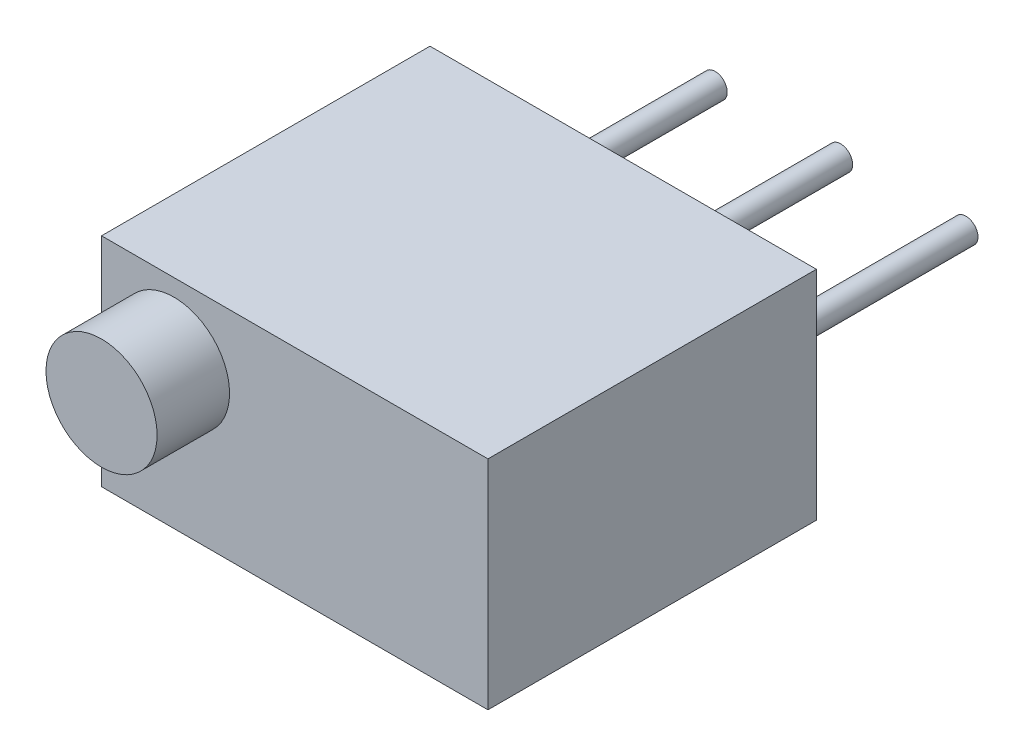
ISO-10303-21;
HEADER;
FILE_DESCRIPTION(('STEP AP214'),'2;1');
FILE_NAME('part.step','',(''),(''),'','','');
FILE_SCHEMA(('AUTOMOTIVE_DESIGN { 1 0 10303 214 1 1 1 1 }'));
ENDSEC;
DATA;
#1=APPLICATION_CONTEXT('core data for automotive mechanical design processes');
#2=APPLICATION_PROTOCOL_DEFINITION('international standard','automotive_design',2000,#1);
#3=PRODUCT_CONTEXT('',#1,'mechanical');
#4=PRODUCT('Part','Part','',(#3));
#5=PRODUCT_RELATED_PRODUCT_CATEGORY('part','',(#4));
#6=PRODUCT_DEFINITION_FORMATION('','',#4);
#7=PRODUCT_DEFINITION_CONTEXT('part definition',#1,'design');
#8=PRODUCT_DEFINITION('design','',#6,#7);
#9=PRODUCT_DEFINITION_SHAPE('','',#8);
#10=(LENGTH_UNIT() NAMED_UNIT(*) SI_UNIT(.MILLI.,.METRE.));
#11=(NAMED_UNIT(*) PLANE_ANGLE_UNIT() SI_UNIT($,.RADIAN.));
#12=(NAMED_UNIT(*) SI_UNIT($,.STERADIAN.) SOLID_ANGLE_UNIT());
#13=UNCERTAINTY_MEASURE_WITH_UNIT(LENGTH_MEASURE(1.E-05),#10,'distance_accuracy_value','');
#14=(GEOMETRIC_REPRESENTATION_CONTEXT(3) GLOBAL_UNCERTAINTY_ASSIGNED_CONTEXT((#13)) GLOBAL_UNIT_ASSIGNED_CONTEXT((#10,
#11,#12)) REPRESENTATION_CONTEXT('',''));
#15=CARTESIAN_POINT('',(0.,0.,0.));
#16=DIRECTION('',(0.,0.,1.));
#17=DIRECTION('',(1.,0.,0.));
#18=AXIS2_PLACEMENT_3D('',#15,#16,#17);
#19=CARTESIAN_POINT('',(-4.,4.5,3.39999999999999));
#20=DIRECTION('',(0.,0.,-1.));
#21=DIRECTION('',(-1.,0.,0.));
#22=AXIS2_PLACEMENT_3D('',#19,#20,#21);
#23=PLANE('',#22);
#24=DIRECTION('',(1.,0.,0.));
#25=VECTOR('',#24,1.);
#26=CARTESIAN_POINT('',(-4.,0.,3.39999999999999));
#27=LINE('',#26,#25);
#28=CARTESIAN_POINT('',(-4.,0.,3.39999999999999));
#29=VERTEX_POINT('',#28);
#30=CARTESIAN_POINT('',(4.00000000000002,0.,3.39999999999999));
#31=VERTEX_POINT('',#30);
#32=EDGE_CURVE('E91',#29,#31,#27,.T.);
#33=ORIENTED_EDGE('',*,*,#32,.T.);
#34=DIRECTION('',(0.,-1.,0.));
#35=VECTOR('',#34,1.);
#36=CARTESIAN_POINT('',(4.00000000000002,4.5,3.39999999999999));
#37=LINE('',#36,#35);
#38=CARTESIAN_POINT('',(4.00000000000002,4.5,3.39999999999999));
#39=VERTEX_POINT('',#38);
#40=EDGE_CURVE('E89',#39,#31,#37,.T.);
#41=ORIENTED_EDGE('',*,*,#40,.F.);
#42=DIRECTION('',(1.,0.,0.));
#43=VECTOR('',#42,1.);
#44=CARTESIAN_POINT('',(-4.,4.5,3.39999999999999));
#45=LINE('',#44,#43);
#46=CARTESIAN_POINT('',(-4.,4.5,3.39999999999999));
#47=VERTEX_POINT('',#46);
#48=EDGE_CURVE('E81',#47,#39,#45,.T.);
#49=ORIENTED_EDGE('',*,*,#48,.F.);
#50=DIRECTION('',(0.,-1.,0.));
#51=VECTOR('',#50,1.);
#52=CARTESIAN_POINT('',(-4.,4.5,3.39999999999999));
#53=LINE('',#52,#51);
#54=EDGE_CURVE('E92',#47,#29,#53,.T.);
#55=ORIENTED_EDGE('',*,*,#54,.T.);
#56=EDGE_LOOP('',(#33,#41,#49,#55));
#57=FACE_BOUND('',#56,.T.);
#58=CARTESIAN_POINT('',(-2.5,3.,3.39999999999999));
#59=DIRECTION('',(0.,0.,-1.));
#60=DIRECTION('',(-1.,0.,0.));
#61=AXIS2_PLACEMENT_3D('',#58,#59,#60);
#62=CIRCLE('',#61,1.15);
#63=CARTESIAN_POINT('',(-3.65,3.,3.39999999999999));
#64=VERTEX_POINT('',#63);
#65=EDGE_CURVE('E11',#64,#64,#62,.F.);
#66=ORIENTED_EDGE('',*,*,#65,.F.);
#67=EDGE_LOOP('',(#66));
#68=FACE_BOUND('',#67,.T.);
#69=ADVANCED_FACE('F33',(#57,#68),#23,.F.);
#70=CARTESIAN_POINT('',(-4.,4.5,-3.4));
#71=DIRECTION('',(0.,0.,1.));
#72=DIRECTION('',(1.,0.,0.));
#73=AXIS2_PLACEMENT_3D('',#70,#71,#72);
#74=PLANE('',#73);
#75=CARTESIAN_POINT('',(-2.59597838181529,2.25,-3.40000000000001));
#76=DIRECTION('',(0.,0.,1.));
#77=DIRECTION('',(1.,0.,0.));
#78=AXIS2_PLACEMENT_3D('',#75,#76,#77);
#79=CIRCLE('',#78,0.25);
#80=CARTESIAN_POINT('',(-2.34597838181529,2.25,-3.40000000000001));
#81=VERTEX_POINT('',#80);
#82=EDGE_CURVE('E114',#81,#81,#79,.F.);
#83=ORIENTED_EDGE('',*,*,#82,.F.);
#84=EDGE_LOOP('',(#83));
#85=FACE_BOUND('',#84,.T.);
#86=DIRECTION('',(-1.,0.,0.));
#87=VECTOR('',#86,1.);
#88=CARTESIAN_POINT('',(-4.,0.,-3.4));
#89=LINE('',#88,#87);
#90=CARTESIAN_POINT('',(4.,0.,-3.40000000000001));
#91=VERTEX_POINT('',#90);
#92=CARTESIAN_POINT('',(-4.,0.,-3.4));
#93=VERTEX_POINT('',#92);
#94=EDGE_CURVE('E73',#91,#93,#89,.T.);
#95=ORIENTED_EDGE('',*,*,#94,.T.);
#96=DIRECTION('',(0.,-1.,0.));
#97=VECTOR('',#96,1.);
#98=CARTESIAN_POINT('',(-4.,4.5,-3.4));
#99=LINE('',#98,#97);
#100=CARTESIAN_POINT('',(-4.,4.5,-3.4));
#101=VERTEX_POINT('',#100);
#102=EDGE_CURVE('E97',#101,#93,#99,.T.);
#103=ORIENTED_EDGE('',*,*,#102,.F.);
#104=DIRECTION('',(-1.,0.,0.));
#105=VECTOR('',#104,1.);
#106=CARTESIAN_POINT('',(-4.,4.5,-3.4));
#107=LINE('',#106,#105);
#108=CARTESIAN_POINT('',(4.,4.5,-3.40000000000001));
#109=VERTEX_POINT('',#108);
#110=EDGE_CURVE('E50',#109,#101,#107,.T.);
#111=ORIENTED_EDGE('',*,*,#110,.F.);
#112=DIRECTION('',(0.,-1.,0.));
#113=VECTOR('',#112,1.);
#114=CARTESIAN_POINT('',(4.,4.5,-3.40000000000001));
#115=LINE('',#114,#113);
#116=EDGE_CURVE('E93',#109,#91,#115,.T.);
#117=ORIENTED_EDGE('',*,*,#116,.T.);
#118=EDGE_LOOP('',(#95,#103,#111,#117));
#119=FACE_BOUND('',#118,.T.);
#120=CARTESIAN_POINT('',(0.,2.25,-3.40000000000001));
#121=DIRECTION('',(0.,0.,1.));
#122=DIRECTION('',(1.,0.,0.));
#123=AXIS2_PLACEMENT_3D('',#120,#121,#122);
#124=CIRCLE('',#123,0.25);
#125=CARTESIAN_POINT('',(0.250000000000008,2.25,-3.40000000000001));
#126=VERTEX_POINT('',#125);
#127=EDGE_CURVE('E111',#126,#126,#124,.F.);
#128=ORIENTED_EDGE('',*,*,#127,.F.);
#129=EDGE_LOOP('',(#128));
#130=FACE_BOUND('',#129,.T.);
#131=CARTESIAN_POINT('',(2.5959783818153,2.25,-3.40000000000001));
#132=DIRECTION('',(0.,0.,1.));
#133=DIRECTION('',(1.,0.,0.));
#134=AXIS2_PLACEMENT_3D('',#131,#132,#133);
#135=CIRCLE('',#134,0.25);
#136=CARTESIAN_POINT('',(2.8459783818153,2.25,-3.40000000000001));
#137=VERTEX_POINT('',#136);
#138=EDGE_CURVE('E42',#137,#137,#135,.F.);
#139=ORIENTED_EDGE('',*,*,#138,.F.);
#140=EDGE_LOOP('',(#139));
#141=FACE_BOUND('',#140,.T.);
#142=ADVANCED_FACE('F121',(#85,#119,#130,#141),#74,.F.);
#143=CARTESIAN_POINT('',(-4.,4.5,-3.4));
#144=DIRECTION('',(1.,0.,0.));
#145=DIRECTION('',(0.,0.,-1.));
#146=AXIS2_PLACEMENT_3D('',#143,#144,#145);
#147=PLANE('',#146);
#148=DIRECTION('',(0.,0.,1.));
#149=VECTOR('',#148,1.);
#150=CARTESIAN_POINT('',(-4.,0.,-3.4));
#151=LINE('',#150,#149);
#152=EDGE_CURVE('E101',#93,#29,#151,.T.);
#153=ORIENTED_EDGE('',*,*,#152,.T.);
#154=ORIENTED_EDGE('',*,*,#54,.F.);
#155=DIRECTION('',(0.,0.,1.));
#156=VECTOR('',#155,1.);
#157=CARTESIAN_POINT('',(-4.,4.5,-3.4));
#158=LINE('',#157,#156);
#159=EDGE_CURVE('E86',#101,#47,#158,.T.);
#160=ORIENTED_EDGE('',*,*,#159,.F.);
#161=ORIENTED_EDGE('',*,*,#102,.T.);
#162=EDGE_LOOP('',(#153,#154,#160,#161));
#163=FACE_BOUND('',#162,.T.);
#164=ADVANCED_FACE('F35',(#163),#147,.F.);
#165=CARTESIAN_POINT('',(4.,4.5,-3.40000000000001));
#166=DIRECTION('',(-1.,0.,0.));
#167=DIRECTION('',(0.,0.,1.));
#168=AXIS2_PLACEMENT_3D('',#165,#166,#167);
#169=PLANE('',#168);
#170=DIRECTION('',(0.,0.,-1.));
#171=VECTOR('',#170,1.);
#172=CARTESIAN_POINT('',(4.,0.,-3.40000000000001));
#173=LINE('',#172,#171);
#174=EDGE_CURVE('E67',#31,#91,#173,.T.);
#175=ORIENTED_EDGE('',*,*,#174,.T.);
#176=ORIENTED_EDGE('',*,*,#116,.F.);
#177=DIRECTION('',(0.,0.,-1.));
#178=VECTOR('',#177,1.);
#179=CARTESIAN_POINT('',(4.,4.5,-3.40000000000001));
#180=LINE('',#179,#178);
#181=EDGE_CURVE('E84',#39,#109,#180,.T.);
#182=ORIENTED_EDGE('',*,*,#181,.F.);
#183=ORIENTED_EDGE('',*,*,#40,.T.);
#184=EDGE_LOOP('',(#175,#176,#182,#183));
#185=FACE_BOUND('',#184,.T.);
#186=ADVANCED_FACE('F95',(#185),#169,.F.);
#187=CARTESIAN_POINT('',(-4.,4.5,3.39999999999999));
#188=DIRECTION('',(0.,1.,0.));
#189=DIRECTION('',(0.,0.,1.));
#190=AXIS2_PLACEMENT_3D('',#187,#188,#189);
#191=PLANE('',#190);
#192=ORIENTED_EDGE('',*,*,#159,.T.);
#193=ORIENTED_EDGE('',*,*,#48,.T.);
#194=ORIENTED_EDGE('',*,*,#181,.T.);
#195=ORIENTED_EDGE('',*,*,#110,.T.);
#196=EDGE_LOOP('',(#192,#193,#194,#195));
#197=FACE_BOUND('',#196,.T.);
#198=ADVANCED_FACE('F82',(#197),#191,.T.);
#199=CARTESIAN_POINT('',(-4.,0.,3.39999999999999));
#200=DIRECTION('',(0.,1.,0.));
#201=DIRECTION('',(0.,0.,1.));
#202=AXIS2_PLACEMENT_3D('',#199,#200,#201);
#203=PLANE('',#202);
#204=ORIENTED_EDGE('',*,*,#152,.F.);
#205=ORIENTED_EDGE('',*,*,#94,.F.);
#206=ORIENTED_EDGE('',*,*,#174,.F.);
#207=ORIENTED_EDGE('',*,*,#32,.F.);
#208=EDGE_LOOP('',(#204,#205,#206,#207));
#209=FACE_BOUND('',#208,.T.);
#210=ADVANCED_FACE('F133',(#209),#203,.F.);
#211=CARTESIAN_POINT('',(0.,2.25,-7.9));
#212=DIRECTION('',(0.,0.,1.));
#213=DIRECTION('',(1.,0.,0.));
#214=AXIS2_PLACEMENT_3D('',#211,#212,#213);
#215=CYLINDRICAL_SURFACE('',#214,0.25);
#216=CARTESIAN_POINT('',(0.,2.25,-7.9));
#217=DIRECTION('',(0.,0.,-1.));
#218=DIRECTION('',(-1.,0.,0.));
#219=AXIS2_PLACEMENT_3D('',#216,#217,#218);
#220=CIRCLE('',#219,0.25);
#221=CARTESIAN_POINT('',(-0.249999999999992,2.25,-7.9));
#222=VERTEX_POINT('',#221);
#223=EDGE_CURVE('E104',#222,#222,#220,.T.);
#224=ORIENTED_EDGE('',*,*,#223,.F.);
#225=EDGE_LOOP('',(#224));
#226=FACE_BOUND('',#225,.T.);
#227=ORIENTED_EDGE('',*,*,#127,.T.);
#228=EDGE_LOOP('',(#227));
#229=FACE_BOUND('',#228,.T.);
#230=ADVANCED_FACE('F142',(#226,#229),#215,.T.);
#231=CARTESIAN_POINT('',(0.,2.25,-7.9));
#232=DIRECTION('',(0.,0.,-1.));
#233=DIRECTION('',(-1.,0.,0.));
#234=AXIS2_PLACEMENT_3D('',#231,#232,#233);
#235=PLANE('',#234);
#236=ORIENTED_EDGE('',*,*,#223,.T.);
#237=EDGE_LOOP('',(#236));
#238=FACE_BOUND('',#237,.T.);
#239=ADVANCED_FACE('F147',(#238),#235,.T.);
#240=CARTESIAN_POINT('',(-2.59597838181529,2.25,-7.9));
#241=DIRECTION('',(0.,0.,1.));
#242=DIRECTION('',(1.,0.,0.));
#243=AXIS2_PLACEMENT_3D('',#240,#241,#242);
#244=CYLINDRICAL_SURFACE('',#243,0.25);
#245=CARTESIAN_POINT('',(-2.59597838181529,2.25,-7.9));
#246=DIRECTION('',(0.,0.,-1.));
#247=DIRECTION('',(-1.,0.,0.));
#248=AXIS2_PLACEMENT_3D('',#245,#246,#247);
#249=CIRCLE('',#248,0.25);
#250=CARTESIAN_POINT('',(-2.84597838181529,2.25,-7.9));
#251=VERTEX_POINT('',#250);
#252=EDGE_CURVE('E182',#251,#251,#249,.T.);
#253=ORIENTED_EDGE('',*,*,#252,.F.);
#254=EDGE_LOOP('',(#253));
#255=FACE_BOUND('',#254,.T.);
#256=ORIENTED_EDGE('',*,*,#82,.T.);
#257=EDGE_LOOP('',(#256));
#258=FACE_BOUND('',#257,.T.);
#259=ADVANCED_FACE('F151',(#255,#258),#244,.T.);
#260=CARTESIAN_POINT('',(-2.59597838181529,2.25,-7.9));
#261=DIRECTION('',(0.,0.,-1.));
#262=DIRECTION('',(-1.,0.,0.));
#263=AXIS2_PLACEMENT_3D('',#260,#261,#262);
#264=PLANE('',#263);
#265=ORIENTED_EDGE('',*,*,#252,.T.);
#266=EDGE_LOOP('',(#265));
#267=FACE_BOUND('',#266,.T.);
#268=ADVANCED_FACE('F155',(#267),#264,.T.);
#269=CARTESIAN_POINT('',(2.5959783818153,2.25,-7.9));
#270=DIRECTION('',(0.,0.,1.));
#271=DIRECTION('',(1.,0.,0.));
#272=AXIS2_PLACEMENT_3D('',#269,#270,#271);
#273=CYLINDRICAL_SURFACE('',#272,0.25);
#274=CARTESIAN_POINT('',(2.5959783818153,2.25,-7.9));
#275=DIRECTION('',(0.,0.,-1.));
#276=DIRECTION('',(1.,0.,0.));
#277=AXIS2_PLACEMENT_3D('',#274,#275,#276);
#278=CIRCLE('',#277,0.25);
#279=CARTESIAN_POINT('',(2.8459783818153,2.25,-7.9));
#280=VERTEX_POINT('',#279);
#281=EDGE_CURVE('E179',#280,#280,#278,.T.);
#282=ORIENTED_EDGE('',*,*,#281,.F.);
#283=EDGE_LOOP('',(#282));
#284=FACE_BOUND('',#283,.T.);
#285=ORIENTED_EDGE('',*,*,#138,.T.);
#286=EDGE_LOOP('',(#285));
#287=FACE_BOUND('',#286,.T.);
#288=ADVANCED_FACE('F119',(#284,#287),#273,.T.);
#289=CARTESIAN_POINT('',(2.5959783818153,2.25,-7.9));
#290=DIRECTION('',(0.,0.,1.));
#291=DIRECTION('',(1.,0.,0.));
#292=AXIS2_PLACEMENT_3D('',#289,#290,#291);
#293=PLANE('',#292);
#294=ORIENTED_EDGE('',*,*,#281,.T.);
#295=EDGE_LOOP('',(#294));
#296=FACE_BOUND('',#295,.T.);
#297=ADVANCED_FACE('F162',(#296),#293,.F.);
#298=CARTESIAN_POINT('',(-2.5,3.,4.9));
#299=DIRECTION('',(0.,0.,-1.));
#300=DIRECTION('',(-1.,0.,0.));
#301=AXIS2_PLACEMENT_3D('',#298,#299,#300);
#302=CYLINDRICAL_SURFACE('',#301,1.15);
#303=CARTESIAN_POINT('',(-2.5,3.,4.9));
#304=DIRECTION('',(0.,0.,1.));
#305=DIRECTION('',(1.,0.,0.));
#306=AXIS2_PLACEMENT_3D('',#303,#304,#305);
#307=CIRCLE('',#306,1.15);
#308=CARTESIAN_POINT('',(-1.35,3.,4.9));
#309=VERTEX_POINT('',#308);
#310=EDGE_CURVE('E178',#309,#309,#307,.T.);
#311=ORIENTED_EDGE('',*,*,#310,.F.);
#312=EDGE_LOOP('',(#311));
#313=FACE_BOUND('',#312,.T.);
#314=ORIENTED_EDGE('',*,*,#65,.T.);
#315=EDGE_LOOP('',(#314));
#316=FACE_BOUND('',#315,.T.);
#317=ADVANCED_FACE('F166',(#313,#316),#302,.T.);
#318=CARTESIAN_POINT('',(-2.5,3.,4.9));
#319=DIRECTION('',(0.,0.,1.));
#320=DIRECTION('',(1.,0.,0.));
#321=AXIS2_PLACEMENT_3D('',#318,#319,#320);
#322=PLANE('',#321);
#323=ORIENTED_EDGE('',*,*,#310,.T.);
#324=EDGE_LOOP('',(#323));
#325=FACE_BOUND('',#324,.T.);
#326=ADVANCED_FACE('F170',(#325),#322,.T.);
#327=CLOSED_SHELL('',(#69,#142,#164,#186,#198,#210,#230,#239,#259,#268,#288,#297,#317,#326));
#328=MANIFOLD_SOLID_BREP('B2',#327);
#329=ADVANCED_BREP_SHAPE_REPRESENTATION('',(#18,#328),#14);
#330=SHAPE_DEFINITION_REPRESENTATION(#9,#329);
ENDSEC;
END-ISO-10303-21;
